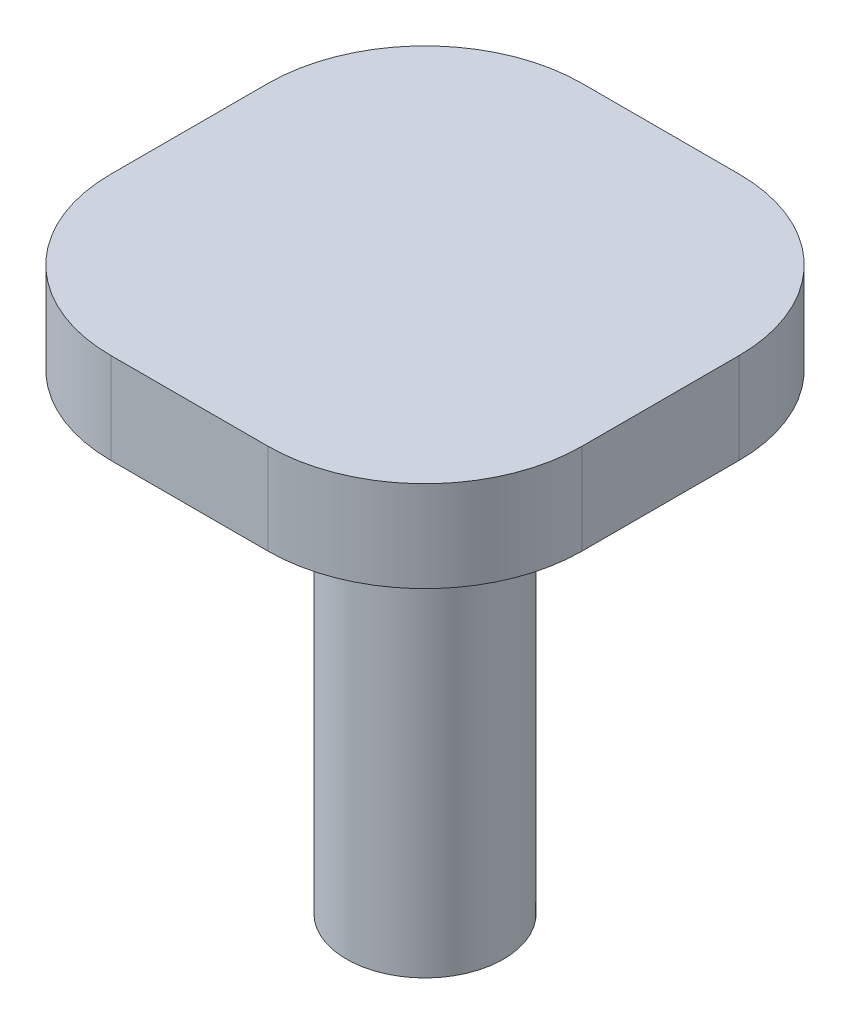
ISO-10303-21;
HEADER;
FILE_DESCRIPTION(('STEP AP214'),'2;1');
FILE_NAME('part.step','',(''),(''),'','','');
FILE_SCHEMA(('AUTOMOTIVE_DESIGN { 1 0 10303 214 1 1 1 1 }'));
ENDSEC;
DATA;
#1=APPLICATION_CONTEXT('core data for automotive mechanical design processes');
#2=APPLICATION_PROTOCOL_DEFINITION('international standard','automotive_design',2000,#1);
#3=PRODUCT_CONTEXT('',#1,'mechanical');
#4=PRODUCT('Part','Part','',(#3));
#5=PRODUCT_RELATED_PRODUCT_CATEGORY('part','',(#4));
#6=PRODUCT_DEFINITION_FORMATION('','',#4);
#7=PRODUCT_DEFINITION_CONTEXT('part definition',#1,'design');
#8=PRODUCT_DEFINITION('design','',#6,#7);
#9=PRODUCT_DEFINITION_SHAPE('','',#8);
#10=(LENGTH_UNIT() NAMED_UNIT(*) SI_UNIT(.MILLI.,.METRE.));
#11=(NAMED_UNIT(*) PLANE_ANGLE_UNIT() SI_UNIT($,.RADIAN.));
#12=(NAMED_UNIT(*) SI_UNIT($,.STERADIAN.) SOLID_ANGLE_UNIT());
#13=UNCERTAINTY_MEASURE_WITH_UNIT(LENGTH_MEASURE(1.E-05),#10,'distance_accuracy_value','');
#14=(GEOMETRIC_REPRESENTATION_CONTEXT(3) GLOBAL_UNCERTAINTY_ASSIGNED_CONTEXT((#13)) GLOBAL_UNIT_ASSIGNED_CONTEXT((#10,
#11,#12)) REPRESENTATION_CONTEXT('',''));
#15=CARTESIAN_POINT('',(0.,0.,0.));
#16=DIRECTION('',(0.,0.,1.));
#17=DIRECTION('',(1.,0.,0.));
#18=AXIS2_PLACEMENT_3D('',#15,#16,#17);
#19=CARTESIAN_POINT('',(-0.5,-3.,0.));
#20=DIRECTION('',(0.,-1.,0.));
#21=DIRECTION('',(0.,0.,-1.));
#22=AXIS2_PLACEMENT_3D('',#19,#20,#21);
#23=CYLINDRICAL_SURFACE('',#22,1.);
#24=CARTESIAN_POINT('',(-0.5,3.,0.));
#25=DIRECTION('',(0.,-1.,0.));
#26=DIRECTION('',(0.,0.,-1.));
#27=AXIS2_PLACEMENT_3D('',#24,#25,#26);
#28=CIRCLE('',#27,1.);
#29=CARTESIAN_POINT('',(-0.5,3.,-1.));
#30=VERTEX_POINT('',#29);
#31=EDGE_CURVE('E157',#30,#30,#28,.T.);
#32=ORIENTED_EDGE('',*,*,#31,.T.);
#33=EDGE_LOOP('',(#32));
#34=FACE_BOUND('',#33,.T.);
#35=CARTESIAN_POINT('',(-0.5,-3.,0.));
#36=DIRECTION('',(0.,-1.,0.));
#37=DIRECTION('',(0.,0.,-1.));
#38=AXIS2_PLACEMENT_3D('',#35,#36,#37);
#39=CIRCLE('',#38,1.);
#40=CARTESIAN_POINT('',(-0.5,-3.,-1.));
#41=VERTEX_POINT('',#40);
#42=EDGE_CURVE('E153',#41,#41,#39,.T.);
#43=ORIENTED_EDGE('',*,*,#42,.F.);
#44=EDGE_LOOP('',(#43));
#45=FACE_BOUND('',#44,.T.);
#46=ADVANCED_FACE('F43',(#34,#45),#23,.T.);
#47=CARTESIAN_POINT('',(0.5,-3.,0.));
#48=DIRECTION('',(0.,-1.,0.));
#49=DIRECTION('',(0.,0.,-1.));
#50=AXIS2_PLACEMENT_3D('',#47,#48,#49);
#51=PLANE('',#50);
#52=ORIENTED_EDGE('',*,*,#42,.T.);
#53=EDGE_LOOP('',(#52));
#54=FACE_BOUND('',#53,.T.);
#55=ADVANCED_FACE('F224',(#54),#51,.T.);
#56=CARTESIAN_POINT('',(-3.5,3.,-3.));
#57=DIRECTION('',(-1.,0.,0.));
#58=DIRECTION('',(0.,0.,1.));
#59=AXIS2_PLACEMENT_3D('',#56,#57,#58);
#60=PLANE('',#59);
#61=DIRECTION('',(0.,0.,1.));
#62=VECTOR('',#61,1.);
#63=CARTESIAN_POINT('',(-3.5,4.15698481970683,-3.));
#64=LINE('',#63,#62);
#65=CARTESIAN_POINT('',(-3.5,4.15698481970683,-1.));
#66=VERTEX_POINT('',#65);
#67=CARTESIAN_POINT('',(-3.5,4.15698481970683,1.));
#68=VERTEX_POINT('',#67);
#69=EDGE_CURVE('E132',#66,#68,#64,.T.);
#70=ORIENTED_EDGE('',*,*,#69,.F.);
#71=DIRECTION('',(0.,-1.,0.));
#72=VECTOR('',#71,1.);
#73=CARTESIAN_POINT('',(-3.5,3.,-1.));
#74=LINE('',#73,#72);
#75=CARTESIAN_POINT('',(-3.5,3.,-1.));
#76=VERTEX_POINT('',#75);
#77=EDGE_CURVE('E115',#66,#76,#74,.T.);
#78=ORIENTED_EDGE('',*,*,#77,.T.);
#79=DIRECTION('',(0.,0.,1.));
#80=VECTOR('',#79,1.);
#81=CARTESIAN_POINT('',(-3.5,3.,-3.));
#82=LINE('',#81,#80);
#83=CARTESIAN_POINT('',(-3.5,3.,1.));
#84=VERTEX_POINT('',#83);
#85=EDGE_CURVE('E129',#76,#84,#82,.T.);
#86=ORIENTED_EDGE('',*,*,#85,.T.);
#87=DIRECTION('',(0.,-1.,0.));
#88=VECTOR('',#87,1.);
#89=CARTESIAN_POINT('',(-3.5,3.,1.));
#90=LINE('',#89,#88);
#91=EDGE_CURVE('E135',#84,#68,#90,.F.);
#92=ORIENTED_EDGE('',*,*,#91,.T.);
#93=EDGE_LOOP('',(#70,#78,#86,#92));
#94=FACE_BOUND('',#93,.T.);
#95=ADVANCED_FACE('F128',(#94),#60,.T.);
#96=CARTESIAN_POINT('',(2.5,4.15698481970683,-3.));
#97=DIRECTION('',(0.,1.,0.));
#98=DIRECTION('',(-1.,0.,0.));
#99=AXIS2_PLACEMENT_3D('',#96,#97,#98);
#100=PLANE('',#99);
#101=DIRECTION('',(-1.,0.,0.));
#102=VECTOR('',#101,1.);
#103=CARTESIAN_POINT('',(2.5,4.15698481970683,-3.));
#104=LINE('',#103,#102);
#105=CARTESIAN_POINT('',(0.5,4.15698481970683,-3.));
#106=VERTEX_POINT('',#105);
#107=CARTESIAN_POINT('',(-1.5,4.15698481970683,-3.));
#108=VERTEX_POINT('',#107);
#109=EDGE_CURVE('E141',#106,#108,#104,.T.);
#110=ORIENTED_EDGE('',*,*,#109,.T.);
#111=CARTESIAN_POINT('',(-1.5,4.15698481970683,-1.));
#112=DIRECTION('',(0.,1.,0.));
#113=DIRECTION('',(-1.,0.,0.));
#114=AXIS2_PLACEMENT_3D('',#111,#112,#113);
#115=CIRCLE('',#114,2.);
#116=EDGE_CURVE('E181',#108,#66,#115,.T.);
#117=ORIENTED_EDGE('',*,*,#116,.T.);
#118=ORIENTED_EDGE('',*,*,#69,.T.);
#119=CARTESIAN_POINT('',(-1.5,4.15698481970683,1.));
#120=DIRECTION('',(0.,1.,0.));
#121=DIRECTION('',(-1.,0.,0.));
#122=AXIS2_PLACEMENT_3D('',#119,#120,#121);
#123=CIRCLE('',#122,2.);
#124=CARTESIAN_POINT('',(-1.5,4.15698481970683,3.));
#125=VERTEX_POINT('',#124);
#126=EDGE_CURVE('E174',#68,#125,#123,.T.);
#127=ORIENTED_EDGE('',*,*,#126,.T.);
#128=DIRECTION('',(-1.,0.,0.));
#129=VECTOR('',#128,1.);
#130=CARTESIAN_POINT('',(2.5,4.15698481970683,3.));
#131=LINE('',#130,#129);
#132=CARTESIAN_POINT('',(0.5,4.15698481970683,3.));
#133=VERTEX_POINT('',#132);
#134=EDGE_CURVE('E198',#133,#125,#131,.T.);
#135=ORIENTED_EDGE('',*,*,#134,.F.);
#136=CARTESIAN_POINT('',(0.5,4.15698481970683,1.));
#137=DIRECTION('',(0.,1.,0.));
#138=DIRECTION('',(-1.,0.,0.));
#139=AXIS2_PLACEMENT_3D('',#136,#137,#138);
#140=CIRCLE('',#139,2.);
#141=CARTESIAN_POINT('',(2.5,4.15698481970683,1.));
#142=VERTEX_POINT('',#141);
#143=EDGE_CURVE('E59',#133,#142,#140,.T.);
#144=ORIENTED_EDGE('',*,*,#143,.T.);
#145=DIRECTION('',(0.,0.,1.));
#146=VECTOR('',#145,1.);
#147=CARTESIAN_POINT('',(2.5,4.15698481970683,-3.));
#148=LINE('',#147,#146);
#149=CARTESIAN_POINT('',(2.5,4.15698481970683,-1.));
#150=VERTEX_POINT('',#149);
#151=EDGE_CURVE('E146',#150,#142,#148,.T.);
#152=ORIENTED_EDGE('',*,*,#151,.F.);
#153=CARTESIAN_POINT('',(0.5,4.15698481970683,-1.));
#154=DIRECTION('',(0.,1.,0.));
#155=DIRECTION('',(-1.,0.,0.));
#156=AXIS2_PLACEMENT_3D('',#153,#154,#155);
#157=CIRCLE('',#156,2.);
#158=EDGE_CURVE('E67',#150,#106,#157,.T.);
#159=ORIENTED_EDGE('',*,*,#158,.T.);
#160=EDGE_LOOP('',(#110,#117,#118,#127,#135,#144,#152,#159));
#161=FACE_BOUND('',#160,.T.);
#162=ADVANCED_FACE('F217',(#161),#100,.T.);
#163=CARTESIAN_POINT('',(2.5,3.,-3.));
#164=DIRECTION('',(1.,0.,0.));
#165=DIRECTION('',(0.,0.,-1.));
#166=AXIS2_PLACEMENT_3D('',#163,#164,#165);
#167=PLANE('',#166);
#168=DIRECTION('',(0.,0.,1.));
#169=VECTOR('',#168,1.);
#170=CARTESIAN_POINT('',(2.5,3.,-3.));
#171=LINE('',#170,#169);
#172=CARTESIAN_POINT('',(2.5,3.,-1.));
#173=VERTEX_POINT('',#172);
#174=CARTESIAN_POINT('',(2.5,3.,1.));
#175=VERTEX_POINT('',#174);
#176=EDGE_CURVE('E140',#173,#175,#171,.T.);
#177=ORIENTED_EDGE('',*,*,#176,.F.);
#178=DIRECTION('',(0.,1.,0.));
#179=VECTOR('',#178,1.);
#180=CARTESIAN_POINT('',(2.5,4.15698481970683,-1.));
#181=LINE('',#180,#179);
#182=EDGE_CURVE('E187',#173,#150,#181,.T.);
#183=ORIENTED_EDGE('',*,*,#182,.T.);
#184=ORIENTED_EDGE('',*,*,#151,.T.);
#185=DIRECTION('',(0.,1.,0.));
#186=VECTOR('',#185,1.);
#187=CARTESIAN_POINT('',(2.5,3.,1.));
#188=LINE('',#187,#186);
#189=EDGE_CURVE('E184',#142,#175,#188,.F.);
#190=ORIENTED_EDGE('',*,*,#189,.T.);
#191=EDGE_LOOP('',(#177,#183,#184,#190));
#192=FACE_BOUND('',#191,.T.);
#193=ADVANCED_FACE('F214',(#192),#167,.T.);
#194=CARTESIAN_POINT('',(2.5,3.,-3.));
#195=DIRECTION('',(0.,-1.,0.));
#196=DIRECTION('',(1.,0.,0.));
#197=AXIS2_PLACEMENT_3D('',#194,#195,#196);
#198=PLANE('',#197);
#199=ORIENTED_EDGE('',*,*,#31,.F.);
#200=EDGE_LOOP('',(#199));
#201=FACE_BOUND('',#200,.T.);
#202=ORIENTED_EDGE('',*,*,#85,.F.);
#203=CARTESIAN_POINT('',(-1.5,3.,-1.));
#204=DIRECTION('',(0.,-1.,0.));
#205=DIRECTION('',(1.,0.,0.));
#206=AXIS2_PLACEMENT_3D('',#203,#204,#205);
#207=CIRCLE('',#206,2.);
#208=CARTESIAN_POINT('',(-1.5,3.,-3.));
#209=VERTEX_POINT('',#208);
#210=EDGE_CURVE('E111',#76,#209,#207,.T.);
#211=ORIENTED_EDGE('',*,*,#210,.T.);
#212=DIRECTION('',(1.,0.,0.));
#213=VECTOR('',#212,1.);
#214=CARTESIAN_POINT('',(2.5,3.,-3.));
#215=LINE('',#214,#213);
#216=CARTESIAN_POINT('',(0.5,3.,-3.));
#217=VERTEX_POINT('',#216);
#218=EDGE_CURVE('E149',#209,#217,#215,.T.);
#219=ORIENTED_EDGE('',*,*,#218,.T.);
#220=CARTESIAN_POINT('',(0.5,3.,-1.));
#221=DIRECTION('',(0.,-1.,0.));
#222=DIRECTION('',(1.,0.,0.));
#223=AXIS2_PLACEMENT_3D('',#220,#221,#222);
#224=CIRCLE('',#223,2.);
#225=EDGE_CURVE('E123',#217,#173,#224,.T.);
#226=ORIENTED_EDGE('',*,*,#225,.T.);
#227=ORIENTED_EDGE('',*,*,#176,.T.);
#228=CARTESIAN_POINT('',(0.5,3.,1.));
#229=DIRECTION('',(0.,-1.,0.));
#230=DIRECTION('',(1.,0.,0.));
#231=AXIS2_PLACEMENT_3D('',#228,#229,#230);
#232=CIRCLE('',#231,2.);
#233=CARTESIAN_POINT('',(0.5,3.,3.));
#234=VERTEX_POINT('',#233);
#235=EDGE_CURVE('E165',#175,#234,#232,.T.);
#236=ORIENTED_EDGE('',*,*,#235,.T.);
#237=DIRECTION('',(1.,0.,0.));
#238=VECTOR('',#237,1.);
#239=CARTESIAN_POINT('',(2.5,3.,3.));
#240=LINE('',#239,#238);
#241=CARTESIAN_POINT('',(-1.5,3.,3.));
#242=VERTEX_POINT('',#241);
#243=EDGE_CURVE('E196',#242,#234,#240,.T.);
#244=ORIENTED_EDGE('',*,*,#243,.F.);
#245=CARTESIAN_POINT('',(-1.5,3.,1.));
#246=DIRECTION('',(0.,-1.,0.));
#247=DIRECTION('',(1.,0.,0.));
#248=AXIS2_PLACEMENT_3D('',#245,#246,#247);
#249=CIRCLE('',#248,2.);
#250=EDGE_CURVE('E134',#242,#84,#249,.T.);
#251=ORIENTED_EDGE('',*,*,#250,.T.);
#252=EDGE_LOOP('',(#202,#211,#219,#226,#227,#236,#244,#251));
#253=FACE_BOUND('',#252,.T.);
#254=ADVANCED_FACE('F137',(#201,#253),#198,.T.);
#255=CARTESIAN_POINT('',(0.,0.,-3.));
#256=DIRECTION('',(0.,0.,1.));
#257=DIRECTION('',(1.,0.,0.));
#258=AXIS2_PLACEMENT_3D('',#255,#256,#257);
#259=PLANE('',#258);
#260=ORIENTED_EDGE('',*,*,#218,.F.);
#261=DIRECTION('',(0.,-1.,0.));
#262=VECTOR('',#261,1.);
#263=CARTESIAN_POINT('',(-1.5,4.15698481970683,-3.));
#264=LINE('',#263,#262);
#265=EDGE_CURVE('E116',#209,#108,#264,.F.);
#266=ORIENTED_EDGE('',*,*,#265,.T.);
#267=ORIENTED_EDGE('',*,*,#109,.F.);
#268=DIRECTION('',(0.,1.,0.));
#269=VECTOR('',#268,1.);
#270=CARTESIAN_POINT('',(0.5,3.,-3.));
#271=LINE('',#270,#269);
#272=EDGE_CURVE('E122',#106,#217,#271,.F.);
#273=ORIENTED_EDGE('',*,*,#272,.T.);
#274=EDGE_LOOP('',(#260,#266,#267,#273));
#275=FACE_BOUND('',#274,.T.);
#276=ADVANCED_FACE('F242',(#275),#259,.F.);
#277=CARTESIAN_POINT('',(0.,0.,3.));
#278=DIRECTION('',(0.,0.,1.));
#279=DIRECTION('',(1.,0.,0.));
#280=AXIS2_PLACEMENT_3D('',#277,#278,#279);
#281=PLANE('',#280);
#282=ORIENTED_EDGE('',*,*,#243,.T.);
#283=DIRECTION('',(0.,1.,0.));
#284=VECTOR('',#283,1.);
#285=CARTESIAN_POINT('',(0.5,0.,3.));
#286=LINE('',#285,#284);
#287=EDGE_CURVE('E11',#234,#133,#286,.T.);
#288=ORIENTED_EDGE('',*,*,#287,.T.);
#289=ORIENTED_EDGE('',*,*,#134,.T.);
#290=DIRECTION('',(0.,-1.,0.));
#291=VECTOR('',#290,1.);
#292=CARTESIAN_POINT('',(-1.5,0.,3.));
#293=LINE('',#292,#291);
#294=EDGE_CURVE('E52',#125,#242,#293,.T.);
#295=ORIENTED_EDGE('',*,*,#294,.T.);
#296=EDGE_LOOP('',(#282,#288,#289,#295));
#297=FACE_BOUND('',#296,.T.);
#298=ADVANCED_FACE('F195',(#297),#281,.T.);
#299=CARTESIAN_POINT('',(-1.5,3.,-1.));
#300=DIRECTION('',(0.,1.,0.));
#301=DIRECTION('',(0.,0.,1.));
#302=AXIS2_PLACEMENT_3D('',#299,#300,#301);
#303=CYLINDRICAL_SURFACE('',#302,2.);
#304=ORIENTED_EDGE('',*,*,#116,.F.);
#305=ORIENTED_EDGE('',*,*,#265,.F.);
#306=ORIENTED_EDGE('',*,*,#210,.F.);
#307=ORIENTED_EDGE('',*,*,#77,.F.);
#308=EDGE_LOOP('',(#304,#305,#306,#307));
#309=FACE_BOUND('',#308,.T.);
#310=ADVANCED_FACE('F114',(#309),#303,.T.);
#311=CARTESIAN_POINT('',(0.5,3.,-1.));
#312=DIRECTION('',(0.,-1.,0.));
#313=DIRECTION('',(0.,0.,-1.));
#314=AXIS2_PLACEMENT_3D('',#311,#312,#313);
#315=CYLINDRICAL_SURFACE('',#314,2.);
#316=ORIENTED_EDGE('',*,*,#225,.F.);
#317=ORIENTED_EDGE('',*,*,#272,.F.);
#318=ORIENTED_EDGE('',*,*,#158,.F.);
#319=ORIENTED_EDGE('',*,*,#182,.F.);
#320=EDGE_LOOP('',(#316,#317,#318,#319));
#321=FACE_BOUND('',#320,.T.);
#322=ADVANCED_FACE('F222',(#321),#315,.T.);
#323=CARTESIAN_POINT('',(0.5,0.,1.));
#324=DIRECTION('',(0.,1.,0.));
#325=DIRECTION('',(0.,0.,1.));
#326=AXIS2_PLACEMENT_3D('',#323,#324,#325);
#327=CYLINDRICAL_SURFACE('',#326,2.);
#328=ORIENTED_EDGE('',*,*,#235,.F.);
#329=ORIENTED_EDGE('',*,*,#189,.F.);
#330=ORIENTED_EDGE('',*,*,#143,.F.);
#331=ORIENTED_EDGE('',*,*,#287,.F.);
#332=EDGE_LOOP('',(#328,#329,#330,#331));
#333=FACE_BOUND('',#332,.T.);
#334=ADVANCED_FACE('F216',(#333),#327,.T.);
#335=CARTESIAN_POINT('',(-1.5,0.,1.));
#336=DIRECTION('',(0.,-1.,0.));
#337=DIRECTION('',(0.,0.,-1.));
#338=AXIS2_PLACEMENT_3D('',#335,#336,#337);
#339=CYLINDRICAL_SURFACE('',#338,2.);
#340=ORIENTED_EDGE('',*,*,#126,.F.);
#341=ORIENTED_EDGE('',*,*,#91,.F.);
#342=ORIENTED_EDGE('',*,*,#250,.F.);
#343=ORIENTED_EDGE('',*,*,#294,.F.);
#344=EDGE_LOOP('',(#340,#341,#342,#343));
#345=FACE_BOUND('',#344,.T.);
#346=ADVANCED_FACE('F45',(#345),#339,.T.);
#347=CLOSED_SHELL('',(#46,#55,#95,#162,#193,#254,#276,#298,#310,#322,#334,#346));
#348=MANIFOLD_SOLID_BREP('B2',#347);
#349=ADVANCED_BREP_SHAPE_REPRESENTATION('',(#18,#348),#14);
#350=SHAPE_DEFINITION_REPRESENTATION(#9,#349);
ENDSEC;
END-ISO-10303-21;
